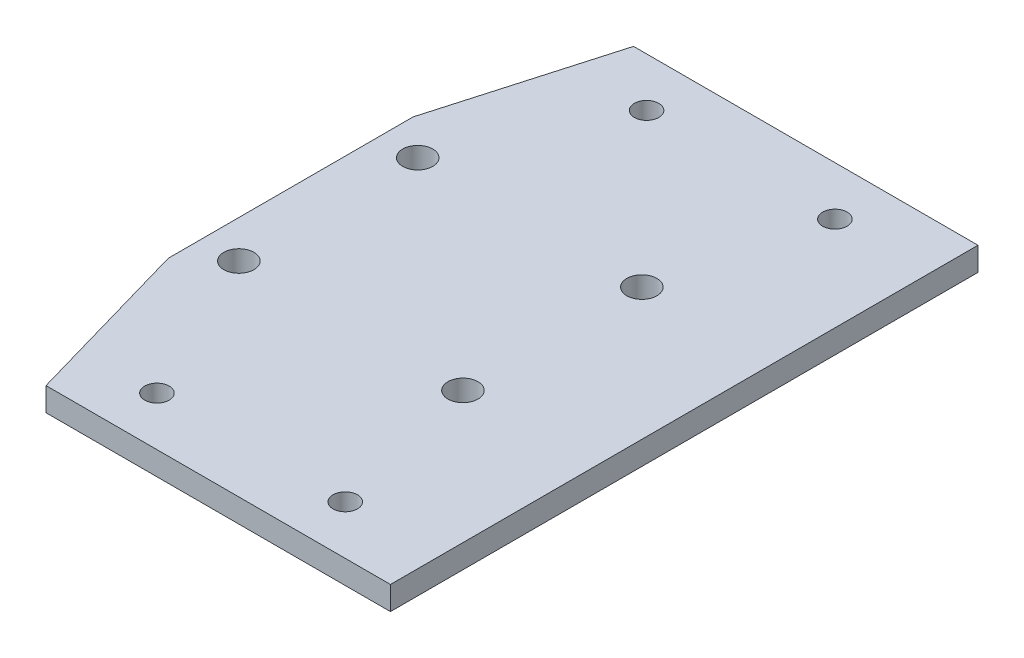
ISO-10303-21;
HEADER;
FILE_DESCRIPTION(('STEP AP214'),'2;1');
FILE_NAME('part.step','',(''),(''),'','','');
FILE_SCHEMA(('AUTOMOTIVE_DESIGN { 1 0 10303 214 1 1 1 1 }'));
ENDSEC;
DATA;
#1=APPLICATION_CONTEXT('core data for automotive mechanical design processes');
#2=APPLICATION_PROTOCOL_DEFINITION('international standard','automotive_design',2000,#1);
#3=PRODUCT_CONTEXT('',#1,'mechanical');
#4=PRODUCT('Part','Part','',(#3));
#5=PRODUCT_RELATED_PRODUCT_CATEGORY('part','',(#4));
#6=PRODUCT_DEFINITION_FORMATION('','',#4);
#7=PRODUCT_DEFINITION_CONTEXT('part definition',#1,'design');
#8=PRODUCT_DEFINITION('design','',#6,#7);
#9=PRODUCT_DEFINITION_SHAPE('','',#8);
#10=(LENGTH_UNIT() NAMED_UNIT(*) SI_UNIT(.MILLI.,.METRE.));
#11=(NAMED_UNIT(*) PLANE_ANGLE_UNIT() SI_UNIT($,.RADIAN.));
#12=(NAMED_UNIT(*) SI_UNIT($,.STERADIAN.) SOLID_ANGLE_UNIT());
#13=UNCERTAINTY_MEASURE_WITH_UNIT(LENGTH_MEASURE(1.E-05),#10,'distance_accuracy_value','');
#14=(GEOMETRIC_REPRESENTATION_CONTEXT(3) GLOBAL_UNCERTAINTY_ASSIGNED_CONTEXT((#13)) GLOBAL_UNIT_ASSIGNED_CONTEXT((#10,
#11,#12)) REPRESENTATION_CONTEXT('',''));
#15=CARTESIAN_POINT('',(0.,0.,0.));
#16=DIRECTION('',(0.,0.,1.));
#17=DIRECTION('',(1.,0.,0.));
#18=AXIS2_PLACEMENT_3D('',#15,#16,#17);
#19=CARTESIAN_POINT('',(-54.9737575063887,-3.175,-23.8697165029833));
#20=DIRECTION('',(0.,0.,-1.));
#21=DIRECTION('',(-1.,0.,0.));
#22=AXIS2_PLACEMENT_3D('',#19,#20,#21);
#23=PLANE('',#22);
#24=DIRECTION('',(0.,-1.,0.));
#25=VECTOR('',#24,1.);
#26=CARTESIAN_POINT('',(-44.2819246599596,-3.175,-23.8697165029833));
#27=LINE('',#26,#25);
#28=CARTESIAN_POINT('',(-44.2819246599596,0.,-23.8697165029833));
#29=VERTEX_POINT('',#28);
#30=CARTESIAN_POINT('',(-44.2819246599596,-3.175,-23.8697165029833));
#31=VERTEX_POINT('',#30);
#32=EDGE_CURVE('E89',#29,#31,#27,.T.);
#33=ORIENTED_EDGE('',*,*,#32,.F.);
#34=DIRECTION('',(-1.,0.,0.));
#35=VECTOR('',#34,1.);
#36=CARTESIAN_POINT('',(-54.9737575063887,0.,-23.8697165029833));
#37=LINE('',#36,#35);
#38=CARTESIAN_POINT('',(2.17624249361133,0.,-23.8697165029833));
#39=VERTEX_POINT('',#38);
#40=EDGE_CURVE('E82',#39,#29,#37,.T.);
#41=ORIENTED_EDGE('',*,*,#40,.F.);
#42=DIRECTION('',(0.,1.,0.));
#43=VECTOR('',#42,1.);
#44=CARTESIAN_POINT('',(2.17624249361133,-3.175,-23.8697165029833));
#45=LINE('',#44,#43);
#46=CARTESIAN_POINT('',(2.17624249361133,-3.175,-23.8697165029833));
#47=VERTEX_POINT('',#46);
#48=EDGE_CURVE('E40',#47,#39,#45,.T.);
#49=ORIENTED_EDGE('',*,*,#48,.F.);
#50=DIRECTION('',(-1.,0.,0.));
#51=VECTOR('',#50,1.);
#52=CARTESIAN_POINT('',(-54.9737575063887,-3.175,-23.8697165029833));
#53=LINE('',#52,#51);
#54=EDGE_CURVE('E94',#47,#31,#53,.T.);
#55=ORIENTED_EDGE('',*,*,#54,.T.);
#56=EDGE_LOOP('',(#33,#41,#49,#55));
#57=FACE_BOUND('',#56,.T.);
#58=ADVANCED_FACE('F32',(#57),#23,.T.);
#59=CARTESIAN_POINT('',(2.17624249361133,-3.175,-23.8697165029833));
#60=DIRECTION('',(1.,0.,0.));
#61=DIRECTION('',(0.,0.,-1.));
#62=AXIS2_PLACEMENT_3D('',#59,#60,#61);
#63=PLANE('',#62);
#64=DIRECTION('',(0.,0.,-1.));
#65=VECTOR('',#64,1.);
#66=CARTESIAN_POINT('',(2.17624249361133,0.,-23.8697165029833));
#67=LINE('',#66,#65);
#68=CARTESIAN_POINT('',(2.17624249361133,0.,55.3782834970167));
#69=VERTEX_POINT('',#68);
#70=EDGE_CURVE('E69',#69,#39,#67,.T.);
#71=ORIENTED_EDGE('',*,*,#70,.F.);
#72=DIRECTION('',(0.,1.,0.));
#73=VECTOR('',#72,1.);
#74=CARTESIAN_POINT('',(2.17624249361133,-3.175,55.3782834970167));
#75=LINE('',#74,#73);
#76=CARTESIAN_POINT('',(2.17624249361133,-3.175,55.3782834970167));
#77=VERTEX_POINT('',#76);
#78=EDGE_CURVE('E73',#77,#69,#75,.T.);
#79=ORIENTED_EDGE('',*,*,#78,.F.);
#80=DIRECTION('',(0.,0.,-1.));
#81=VECTOR('',#80,1.);
#82=CARTESIAN_POINT('',(2.17624249361133,-3.175,-23.8697165029833));
#83=LINE('',#82,#81);
#84=EDGE_CURVE('E71',#77,#47,#83,.T.);
#85=ORIENTED_EDGE('',*,*,#84,.T.);
#86=ORIENTED_EDGE('',*,*,#48,.T.);
#87=EDGE_LOOP('',(#71,#79,#85,#86));
#88=FACE_BOUND('',#87,.T.);
#89=ADVANCED_FACE('F67',(#88),#63,.T.);
#90=CARTESIAN_POINT('',(-54.9737575063887,-3.175,55.3782834970167));
#91=DIRECTION('',(0.,0.,1.));
#92=DIRECTION('',(1.,0.,0.));
#93=AXIS2_PLACEMENT_3D('',#90,#91,#92);
#94=PLANE('',#93);
#95=DIRECTION('',(0.,1.,0.));
#96=VECTOR('',#95,1.);
#97=CARTESIAN_POINT('',(-44.2819246599596,-3.175,55.3782834970167));
#98=LINE('',#97,#96);
#99=CARTESIAN_POINT('',(-44.2819246599596,-3.175,55.3782834970167));
#100=VERTEX_POINT('',#99);
#101=CARTESIAN_POINT('',(-44.2819246599596,0.,55.3782834970167));
#102=VERTEX_POINT('',#101);
#103=EDGE_CURVE('E148',#100,#102,#98,.T.);
#104=ORIENTED_EDGE('',*,*,#103,.F.);
#105=DIRECTION('',(1.,0.,0.));
#106=VECTOR('',#105,1.);
#107=CARTESIAN_POINT('',(-54.9737575063887,-3.175,55.3782834970167));
#108=LINE('',#107,#106);
#109=EDGE_CURVE('E90',#100,#77,#108,.T.);
#110=ORIENTED_EDGE('',*,*,#109,.T.);
#111=ORIENTED_EDGE('',*,*,#78,.T.);
#112=DIRECTION('',(1.,0.,0.));
#113=VECTOR('',#112,1.);
#114=CARTESIAN_POINT('',(-54.9737575063887,0.,55.3782834970167));
#115=LINE('',#114,#113);
#116=EDGE_CURVE('E84',#102,#69,#115,.T.);
#117=ORIENTED_EDGE('',*,*,#116,.F.);
#118=EDGE_LOOP('',(#104,#110,#111,#117));
#119=FACE_BOUND('',#118,.T.);
#120=ADVANCED_FACE('F34',(#119),#94,.T.);
#121=CARTESIAN_POINT('',(0.,-3.175,0.));
#122=DIRECTION('',(0.,1.,0.));
#123=DIRECTION('',(0.,0.,1.));
#124=AXIS2_PLACEMENT_3D('',#121,#122,#123);
#125=PLANE('',#124);
#126=ORIENTED_EDGE('',*,*,#109,.F.);
#127=DIRECTION('',(-0.275637355817,0.,-0.961261695938319));
#128=VECTOR('',#127,1.);
#129=CARTESIAN_POINT('',(-40.9211063075284,-3.175,67.0988499624107));
#130=LINE('',#129,#128);
#131=CARTESIAN_POINT('',(-50.9097575063887,-3.175,32.2642834970167));
#132=VERTEX_POINT('',#131);
#133=EDGE_CURVE('E162',#100,#132,#130,.T.);
#134=ORIENTED_EDGE('',*,*,#133,.T.);
#135=DIRECTION('',(0.,0.,-1.));
#136=VECTOR('',#135,1.);
#137=CARTESIAN_POINT('',(-50.9097575063887,-3.175,32.2642834970167));
#138=LINE('',#137,#136);
#139=CARTESIAN_POINT('',(-50.9097575063887,-3.175,-0.755716502983297));
#140=VERTEX_POINT('',#139);
#141=EDGE_CURVE('E167',#132,#140,#138,.T.);
#142=ORIENTED_EDGE('',*,*,#141,.T.);
#143=DIRECTION('',(0.275637355817,0.,-0.961261695938319));
#144=VECTOR('',#143,1.);
#145=CARTESIAN_POINT('',(-50.9097575063887,-3.175,-0.755716502983297));
#146=LINE('',#145,#144);
#147=EDGE_CURVE('E156',#140,#31,#146,.T.);
#148=ORIENTED_EDGE('',*,*,#147,.T.);
#149=ORIENTED_EDGE('',*,*,#54,.F.);
#150=ORIENTED_EDGE('',*,*,#84,.F.);
#151=EDGE_LOOP('',(#126,#134,#142,#148,#149,#150));
#152=FACE_BOUND('',#151,.T.);
#153=CARTESIAN_POINT('',(-15.6037575063887,-3.175,27.8192834970167));
#154=DIRECTION('',(0.,1.,0.));
#155=DIRECTION('',(0.,0.,1.));
#156=AXIS2_PLACEMENT_3D('',#153,#154,#155);
#157=CIRCLE('',#156,2.032);
#158=CARTESIAN_POINT('',(-15.6037575063887,-3.175,29.8512834970167));
#159=VERTEX_POINT('',#158);
#160=EDGE_CURVE('E142',#159,#159,#157,.T.);
#161=ORIENTED_EDGE('',*,*,#160,.T.);
#162=EDGE_LOOP('',(#161));
#163=FACE_BOUND('',#162,.T.);
#164=CARTESIAN_POINT('',(-45.8297575063887,-3.175,27.8192834970167));
#165=DIRECTION('',(0.,1.,0.));
#166=DIRECTION('',(0.,0.,1.));
#167=AXIS2_PLACEMENT_3D('',#164,#165,#166);
#168=CIRCLE('',#167,2.032);
#169=CARTESIAN_POINT('',(-45.8297575063887,-3.175,29.8512834970167));
#170=VERTEX_POINT('',#169);
#171=EDGE_CURVE('E136',#170,#170,#168,.T.);
#172=ORIENTED_EDGE('',*,*,#171,.T.);
#173=EDGE_LOOP('',(#172));
#174=FACE_BOUND('',#173,.T.);
#175=CARTESIAN_POINT('',(-15.6037575063887,-3.175,3.68928349701671));
#176=DIRECTION('',(0.,1.,0.));
#177=DIRECTION('',(0.,0.,1.));
#178=AXIS2_PLACEMENT_3D('',#175,#176,#177);
#179=CIRCLE('',#178,2.032);
#180=CARTESIAN_POINT('',(-15.6037575063887,-3.175,5.72128349701671));
#181=VERTEX_POINT('',#180);
#182=EDGE_CURVE('E130',#181,#181,#179,.T.);
#183=ORIENTED_EDGE('',*,*,#182,.T.);
#184=EDGE_LOOP('',(#183));
#185=FACE_BOUND('',#184,.T.);
#186=CARTESIAN_POINT('',(-45.8297575063887,-3.175,3.68928349701671));
#187=DIRECTION('',(0.,1.,0.));
#188=DIRECTION('',(0.,0.,1.));
#189=AXIS2_PLACEMENT_3D('',#186,#187,#188);
#190=CIRCLE('',#189,2.032);
#191=CARTESIAN_POINT('',(-45.8297575063887,-3.175,5.72128349701671));
#192=VERTEX_POINT('',#191);
#193=EDGE_CURVE('E124',#192,#192,#190,.T.);
#194=ORIENTED_EDGE('',*,*,#193,.T.);
#195=EDGE_LOOP('',(#194));
#196=FACE_BOUND('',#195,.T.);
#197=CARTESIAN_POINT('',(-10.5237575063887,-3.175,-17.2657165029833));
#198=DIRECTION('',(0.,1.,0.));
#199=DIRECTION('',(0.,0.,1.));
#200=AXIS2_PLACEMENT_3D('',#197,#198,#199);
#201=CIRCLE('',#200,1.651);
#202=CARTESIAN_POINT('',(-10.5237575063887,-3.175,-15.6147165029833));
#203=VERTEX_POINT('',#202);
#204=EDGE_CURVE('E118',#203,#203,#201,.T.);
#205=ORIENTED_EDGE('',*,*,#204,.T.);
#206=EDGE_LOOP('',(#205));
#207=FACE_BOUND('',#206,.T.);
#208=CARTESIAN_POINT('',(-10.5237575063887,-3.175,48.7742834970167));
#209=DIRECTION('',(0.,1.,0.));
#210=DIRECTION('',(0.,0.,1.));
#211=AXIS2_PLACEMENT_3D('',#208,#209,#210);
#212=CIRCLE('',#211,1.651);
#213=CARTESIAN_POINT('',(-10.5237575063887,-3.175,50.4252834970167));
#214=VERTEX_POINT('',#213);
#215=EDGE_CURVE('E112',#214,#214,#212,.T.);
#216=ORIENTED_EDGE('',*,*,#215,.T.);
#217=EDGE_LOOP('',(#216));
#218=FACE_BOUND('',#217,.T.);
#219=CARTESIAN_POINT('',(-35.9237575063887,-3.175,-17.2657165029833));
#220=DIRECTION('',(0.,1.,0.));
#221=DIRECTION('',(0.,0.,1.));
#222=AXIS2_PLACEMENT_3D('',#219,#220,#221);
#223=CIRCLE('',#222,1.651);
#224=CARTESIAN_POINT('',(-35.9237575063887,-3.175,-15.6147165029833));
#225=VERTEX_POINT('',#224);
#226=EDGE_CURVE('E106',#225,#225,#223,.T.);
#227=ORIENTED_EDGE('',*,*,#226,.T.);
#228=EDGE_LOOP('',(#227));
#229=FACE_BOUND('',#228,.T.);
#230=CARTESIAN_POINT('',(-35.9237575063887,-3.175,48.7742834970167));
#231=DIRECTION('',(0.,1.,0.));
#232=DIRECTION('',(0.,0.,1.));
#233=AXIS2_PLACEMENT_3D('',#230,#231,#232);
#234=CIRCLE('',#233,1.651);
#235=CARTESIAN_POINT('',(-35.9237575063887,-3.175,50.4252834970167));
#236=VERTEX_POINT('',#235);
#237=EDGE_CURVE('E99',#236,#236,#234,.T.);
#238=ORIENTED_EDGE('',*,*,#237,.T.);
#239=EDGE_LOOP('',(#238));
#240=FACE_BOUND('',#239,.T.);
#241=ADVANCED_FACE('F175',(#152,#163,#174,#185,#196,#207,#218,#229,#240),#125,.F.);
#242=CARTESIAN_POINT('',(0.,0.,0.));
#243=DIRECTION('',(0.,1.,0.));
#244=DIRECTION('',(0.,0.,1.));
#245=AXIS2_PLACEMENT_3D('',#242,#243,#244);
#246=PLANE('',#245);
#247=DIRECTION('',(-0.275637355817,0.,-0.961261695938319));
#248=VECTOR('',#247,1.);
#249=CARTESIAN_POINT('',(-55.5905729036088,0.,15.9403402717985));
#250=LINE('',#249,#248);
#251=CARTESIAN_POINT('',(-50.9097575063887,0.,32.2642834970167));
#252=VERTEX_POINT('',#251);
#253=EDGE_CURVE('E11',#102,#252,#250,.T.);
#254=ORIENTED_EDGE('',*,*,#253,.F.);
#255=ORIENTED_EDGE('',*,*,#116,.T.);
#256=ORIENTED_EDGE('',*,*,#70,.T.);
#257=ORIENTED_EDGE('',*,*,#40,.T.);
#258=DIRECTION('',(0.275637355817,0.,-0.961261695938319));
#259=VECTOR('',#258,1.);
#260=CARTESIAN_POINT('',(-50.9097575063887,0.,-0.755716502983297));
#261=LINE('',#260,#259);
#262=CARTESIAN_POINT('',(-50.9097575063887,0.,-0.755716502983297));
#263=VERTEX_POINT('',#262);
#264=EDGE_CURVE('E159',#263,#29,#261,.T.);
#265=ORIENTED_EDGE('',*,*,#264,.F.);
#266=DIRECTION('',(0.,0.,-1.));
#267=VECTOR('',#266,1.);
#268=CARTESIAN_POINT('',(-50.9097575063887,0.,32.2642834970167));
#269=LINE('',#268,#267);
#270=EDGE_CURVE('E163',#252,#263,#269,.T.);
#271=ORIENTED_EDGE('',*,*,#270,.F.);
#272=EDGE_LOOP('',(#254,#255,#256,#257,#265,#271));
#273=FACE_BOUND('',#272,.T.);
#274=CARTESIAN_POINT('',(-15.6037575063887,0.,27.8192834970167));
#275=DIRECTION('',(0.,1.,0.));
#276=DIRECTION('',(0.,0.,1.));
#277=AXIS2_PLACEMENT_3D('',#274,#275,#276);
#278=CIRCLE('',#277,2.032);
#279=CARTESIAN_POINT('',(-15.6037575063887,0.,29.8512834970167));
#280=VERTEX_POINT('',#279);
#281=EDGE_CURVE('E145',#280,#280,#278,.T.);
#282=ORIENTED_EDGE('',*,*,#281,.F.);
#283=EDGE_LOOP('',(#282));
#284=FACE_BOUND('',#283,.T.);
#285=CARTESIAN_POINT('',(-45.8297575063887,0.,27.8192834970167));
#286=DIRECTION('',(0.,1.,0.));
#287=DIRECTION('',(0.,0.,1.));
#288=AXIS2_PLACEMENT_3D('',#285,#286,#287);
#289=CIRCLE('',#288,2.032);
#290=CARTESIAN_POINT('',(-45.8297575063887,0.,29.8512834970167));
#291=VERTEX_POINT('',#290);
#292=EDGE_CURVE('E139',#291,#291,#289,.T.);
#293=ORIENTED_EDGE('',*,*,#292,.F.);
#294=EDGE_LOOP('',(#293));
#295=FACE_BOUND('',#294,.T.);
#296=CARTESIAN_POINT('',(-15.6037575063887,0.,3.68928349701671));
#297=DIRECTION('',(0.,1.,0.));
#298=DIRECTION('',(0.,0.,1.));
#299=AXIS2_PLACEMENT_3D('',#296,#297,#298);
#300=CIRCLE('',#299,2.032);
#301=CARTESIAN_POINT('',(-15.6037575063887,0.,5.72128349701671));
#302=VERTEX_POINT('',#301);
#303=EDGE_CURVE('E133',#302,#302,#300,.T.);
#304=ORIENTED_EDGE('',*,*,#303,.F.);
#305=EDGE_LOOP('',(#304));
#306=FACE_BOUND('',#305,.T.);
#307=CARTESIAN_POINT('',(-45.8297575063887,0.,3.68928349701671));
#308=DIRECTION('',(0.,1.,0.));
#309=DIRECTION('',(0.,0.,1.));
#310=AXIS2_PLACEMENT_3D('',#307,#308,#309);
#311=CIRCLE('',#310,2.032);
#312=CARTESIAN_POINT('',(-45.8297575063887,0.,5.72128349701671));
#313=VERTEX_POINT('',#312);
#314=EDGE_CURVE('E127',#313,#313,#311,.T.);
#315=ORIENTED_EDGE('',*,*,#314,.F.);
#316=EDGE_LOOP('',(#315));
#317=FACE_BOUND('',#316,.T.);
#318=CARTESIAN_POINT('',(-10.5237575063887,0.,-17.2657165029833));
#319=DIRECTION('',(0.,1.,0.));
#320=DIRECTION('',(0.,0.,1.));
#321=AXIS2_PLACEMENT_3D('',#318,#319,#320);
#322=CIRCLE('',#321,1.651);
#323=CARTESIAN_POINT('',(-10.5237575063887,0.,-15.6147165029833));
#324=VERTEX_POINT('',#323);
#325=EDGE_CURVE('E121',#324,#324,#322,.T.);
#326=ORIENTED_EDGE('',*,*,#325,.F.);
#327=EDGE_LOOP('',(#326));
#328=FACE_BOUND('',#327,.T.);
#329=CARTESIAN_POINT('',(-10.5237575063887,0.,48.7742834970167));
#330=DIRECTION('',(0.,1.,0.));
#331=DIRECTION('',(0.,0.,1.));
#332=AXIS2_PLACEMENT_3D('',#329,#330,#331);
#333=CIRCLE('',#332,1.651);
#334=CARTESIAN_POINT('',(-10.5237575063887,0.,50.4252834970167));
#335=VERTEX_POINT('',#334);
#336=EDGE_CURVE('E115',#335,#335,#333,.T.);
#337=ORIENTED_EDGE('',*,*,#336,.F.);
#338=EDGE_LOOP('',(#337));
#339=FACE_BOUND('',#338,.T.);
#340=CARTESIAN_POINT('',(-35.9237575063887,0.,-17.2657165029833));
#341=DIRECTION('',(0.,1.,0.));
#342=DIRECTION('',(0.,0.,1.));
#343=AXIS2_PLACEMENT_3D('',#340,#341,#342);
#344=CIRCLE('',#343,1.651);
#345=CARTESIAN_POINT('',(-35.9237575063887,0.,-15.6147165029833));
#346=VERTEX_POINT('',#345);
#347=EDGE_CURVE('E109',#346,#346,#344,.T.);
#348=ORIENTED_EDGE('',*,*,#347,.F.);
#349=EDGE_LOOP('',(#348));
#350=FACE_BOUND('',#349,.T.);
#351=CARTESIAN_POINT('',(-35.9237575063887,0.,48.7742834970167));
#352=DIRECTION('',(0.,1.,0.));
#353=DIRECTION('',(0.,0.,1.));
#354=AXIS2_PLACEMENT_3D('',#351,#352,#353);
#355=CIRCLE('',#354,1.651);
#356=CARTESIAN_POINT('',(-35.9237575063887,0.,50.4252834970167));
#357=VERTEX_POINT('',#356);
#358=EDGE_CURVE('E101',#357,#357,#355,.T.);
#359=ORIENTED_EDGE('',*,*,#358,.F.);
#360=EDGE_LOOP('',(#359));
#361=FACE_BOUND('',#360,.T.);
#362=ADVANCED_FACE('F78',(#273,#284,#295,#306,#317,#328,#339,#350,#361),#246,.T.);
#363=CARTESIAN_POINT('',(-35.9237575063887,-3.175,48.7742834970167));
#364=DIRECTION('',(0.,1.,0.));
#365=DIRECTION('',(0.,0.,1.));
#366=AXIS2_PLACEMENT_3D('',#363,#364,#365);
#367=CYLINDRICAL_SURFACE('',#366,1.651);
#368=ORIENTED_EDGE('',*,*,#237,.F.);
#369=EDGE_LOOP('',(#368));
#370=FACE_BOUND('',#369,.T.);
#371=ORIENTED_EDGE('',*,*,#358,.T.);
#372=EDGE_LOOP('',(#371));
#373=FACE_BOUND('',#372,.T.);
#374=ADVANCED_FACE('F212',(#370,#373),#367,.F.);
#375=CARTESIAN_POINT('',(-35.9237575063887,-3.175,-17.2657165029833));
#376=DIRECTION('',(0.,1.,0.));
#377=DIRECTION('',(0.,0.,1.));
#378=AXIS2_PLACEMENT_3D('',#375,#376,#377);
#379=CYLINDRICAL_SURFACE('',#378,1.651);
#380=ORIENTED_EDGE('',*,*,#226,.F.);
#381=EDGE_LOOP('',(#380));
#382=FACE_BOUND('',#381,.T.);
#383=ORIENTED_EDGE('',*,*,#347,.T.);
#384=EDGE_LOOP('',(#383));
#385=FACE_BOUND('',#384,.T.);
#386=ADVANCED_FACE('F217',(#382,#385),#379,.F.);
#387=CARTESIAN_POINT('',(-10.5237575063887,-3.175,48.7742834970167));
#388=DIRECTION('',(0.,1.,0.));
#389=DIRECTION('',(0.,0.,1.));
#390=AXIS2_PLACEMENT_3D('',#387,#388,#389);
#391=CYLINDRICAL_SURFACE('',#390,1.651);
#392=ORIENTED_EDGE('',*,*,#215,.F.);
#393=EDGE_LOOP('',(#392));
#394=FACE_BOUND('',#393,.T.);
#395=ORIENTED_EDGE('',*,*,#336,.T.);
#396=EDGE_LOOP('',(#395));
#397=FACE_BOUND('',#396,.T.);
#398=ADVANCED_FACE('F221',(#394,#397),#391,.F.);
#399=CARTESIAN_POINT('',(-10.5237575063887,-3.175,-17.2657165029833));
#400=DIRECTION('',(0.,1.,0.));
#401=DIRECTION('',(0.,0.,1.));
#402=AXIS2_PLACEMENT_3D('',#399,#400,#401);
#403=CYLINDRICAL_SURFACE('',#402,1.651);
#404=ORIENTED_EDGE('',*,*,#204,.F.);
#405=EDGE_LOOP('',(#404));
#406=FACE_BOUND('',#405,.T.);
#407=ORIENTED_EDGE('',*,*,#325,.T.);
#408=EDGE_LOOP('',(#407));
#409=FACE_BOUND('',#408,.T.);
#410=ADVANCED_FACE('F225',(#406,#409),#403,.F.);
#411=CARTESIAN_POINT('',(-45.8297575063887,-3.175,3.68928349701671));
#412=DIRECTION('',(0.,1.,0.));
#413=DIRECTION('',(0.,0.,1.));
#414=AXIS2_PLACEMENT_3D('',#411,#412,#413);
#415=CYLINDRICAL_SURFACE('',#414,2.032);
#416=ORIENTED_EDGE('',*,*,#193,.F.);
#417=EDGE_LOOP('',(#416));
#418=FACE_BOUND('',#417,.T.);
#419=ORIENTED_EDGE('',*,*,#314,.T.);
#420=EDGE_LOOP('',(#419));
#421=FACE_BOUND('',#420,.T.);
#422=ADVANCED_FACE('F229',(#418,#421),#415,.F.);
#423=CARTESIAN_POINT('',(-15.6037575063887,-3.175,3.68928349701671));
#424=DIRECTION('',(0.,1.,0.));
#425=DIRECTION('',(0.,0.,1.));
#426=AXIS2_PLACEMENT_3D('',#423,#424,#425);
#427=CYLINDRICAL_SURFACE('',#426,2.032);
#428=ORIENTED_EDGE('',*,*,#182,.F.);
#429=EDGE_LOOP('',(#428));
#430=FACE_BOUND('',#429,.T.);
#431=ORIENTED_EDGE('',*,*,#303,.T.);
#432=EDGE_LOOP('',(#431));
#433=FACE_BOUND('',#432,.T.);
#434=ADVANCED_FACE('F233',(#430,#433),#427,.F.);
#435=CARTESIAN_POINT('',(-45.8297575063887,-3.175,27.8192834970167));
#436=DIRECTION('',(0.,1.,0.));
#437=DIRECTION('',(0.,0.,1.));
#438=AXIS2_PLACEMENT_3D('',#435,#436,#437);
#439=CYLINDRICAL_SURFACE('',#438,2.032);
#440=ORIENTED_EDGE('',*,*,#171,.F.);
#441=EDGE_LOOP('',(#440));
#442=FACE_BOUND('',#441,.T.);
#443=ORIENTED_EDGE('',*,*,#292,.T.);
#444=EDGE_LOOP('',(#443));
#445=FACE_BOUND('',#444,.T.);
#446=ADVANCED_FACE('F237',(#442,#445),#439,.F.);
#447=CARTESIAN_POINT('',(-15.6037575063887,-3.175,27.8192834970167));
#448=DIRECTION('',(0.,1.,0.));
#449=DIRECTION('',(0.,0.,1.));
#450=AXIS2_PLACEMENT_3D('',#447,#448,#449);
#451=CYLINDRICAL_SURFACE('',#450,2.032);
#452=ORIENTED_EDGE('',*,*,#160,.F.);
#453=EDGE_LOOP('',(#452));
#454=FACE_BOUND('',#453,.T.);
#455=ORIENTED_EDGE('',*,*,#281,.T.);
#456=EDGE_LOOP('',(#455));
#457=FACE_BOUND('',#456,.T.);
#458=ADVANCED_FACE('F202',(#454,#457),#451,.F.);
#459=CARTESIAN_POINT('',(-40.9211063075284,-3.175,67.0988499624107));
#460=DIRECTION('',(0.961261695938319,0.,-0.275637355817));
#461=DIRECTION('',(-0.275637355817,0.,-0.961261695938319));
#462=AXIS2_PLACEMENT_3D('',#459,#460,#461);
#463=PLANE('',#462);
#464=ORIENTED_EDGE('',*,*,#103,.T.);
#465=ORIENTED_EDGE('',*,*,#253,.T.);
#466=DIRECTION('',(0.,1.,0.));
#467=VECTOR('',#466,1.);
#468=CARTESIAN_POINT('',(-50.9097575063887,-3.175,32.2642834970167));
#469=LINE('',#468,#467);
#470=EDGE_CURVE('E47',#132,#252,#469,.T.);
#471=ORIENTED_EDGE('',*,*,#470,.F.);
#472=ORIENTED_EDGE('',*,*,#133,.F.);
#473=EDGE_LOOP('',(#464,#465,#471,#472));
#474=FACE_BOUND('',#473,.T.);
#475=ADVANCED_FACE('F182',(#474),#463,.F.);
#476=CARTESIAN_POINT('',(-50.9097575063887,-3.175,-0.755716502983297));
#477=DIRECTION('',(0.961261695938319,0.,0.275637355817));
#478=DIRECTION('',(0.275637355817,0.,-0.961261695938319));
#479=AXIS2_PLACEMENT_3D('',#476,#477,#478);
#480=PLANE('',#479);
#481=ORIENTED_EDGE('',*,*,#32,.T.);
#482=ORIENTED_EDGE('',*,*,#147,.F.);
#483=DIRECTION('',(0.,1.,0.));
#484=VECTOR('',#483,1.);
#485=CARTESIAN_POINT('',(-50.9097575063887,-3.175,-0.755716502983297));
#486=LINE('',#485,#484);
#487=EDGE_CURVE('E154',#140,#263,#486,.T.);
#488=ORIENTED_EDGE('',*,*,#487,.T.);
#489=ORIENTED_EDGE('',*,*,#264,.T.);
#490=EDGE_LOOP('',(#481,#482,#488,#489));
#491=FACE_BOUND('',#490,.T.);
#492=ADVANCED_FACE('F194',(#491),#480,.F.);
#493=CARTESIAN_POINT('',(-50.9097575063887,-3.175,32.2642834970167));
#494=DIRECTION('',(1.,0.,0.));
#495=DIRECTION('',(0.,0.,-1.));
#496=AXIS2_PLACEMENT_3D('',#493,#494,#495);
#497=PLANE('',#496);
#498=ORIENTED_EDGE('',*,*,#270,.T.);
#499=ORIENTED_EDGE('',*,*,#487,.F.);
#500=ORIENTED_EDGE('',*,*,#141,.F.);
#501=ORIENTED_EDGE('',*,*,#470,.T.);
#502=EDGE_LOOP('',(#498,#499,#500,#501));
#503=FACE_BOUND('',#502,.T.);
#504=ADVANCED_FACE('F191',(#503),#497,.F.);
#505=CLOSED_SHELL('',(#58,#89,#120,#241,#362,#374,#386,#398,#410,#422,#434,#446,#458,#475,#492,#504));
#506=MANIFOLD_SOLID_BREP('B2',#505);
#507=ADVANCED_BREP_SHAPE_REPRESENTATION('',(#18,#506),#14);
#508=SHAPE_DEFINITION_REPRESENTATION(#9,#507);
ENDSEC;
END-ISO-10303-21;
